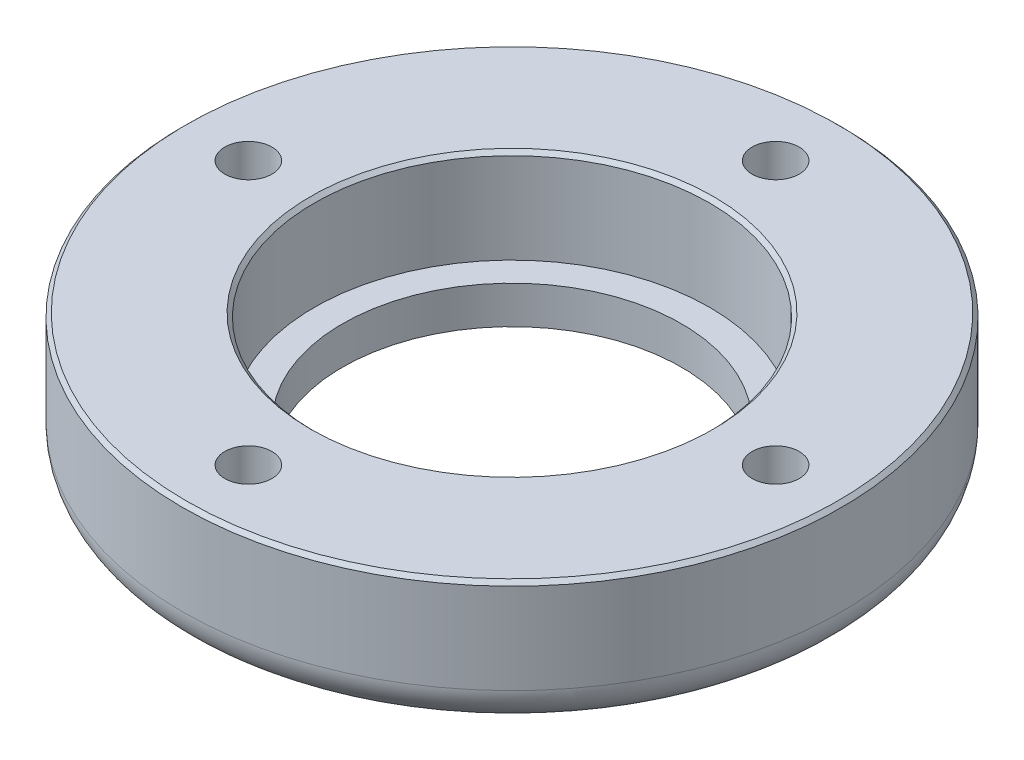
ISO-10303-21;
HEADER;
FILE_DESCRIPTION(('STEP AP214'),'2;1');
FILE_NAME('part.step','',(''),(''),'','','');
FILE_SCHEMA(('AUTOMOTIVE_DESIGN { 1 0 10303 214 1 1 1 1 }'));
ENDSEC;
DATA;
#1=APPLICATION_CONTEXT('core data for automotive mechanical design processes');
#2=APPLICATION_PROTOCOL_DEFINITION('international standard','automotive_design',2000,#1);
#3=PRODUCT_CONTEXT('',#1,'mechanical');
#4=PRODUCT('Part','Part','',(#3));
#5=PRODUCT_RELATED_PRODUCT_CATEGORY('part','',(#4));
#6=PRODUCT_DEFINITION_FORMATION('','',#4);
#7=PRODUCT_DEFINITION_CONTEXT('part definition',#1,'design');
#8=PRODUCT_DEFINITION('design','',#6,#7);
#9=PRODUCT_DEFINITION_SHAPE('','',#8);
#10=(LENGTH_UNIT() NAMED_UNIT(*) SI_UNIT(.MILLI.,.METRE.));
#11=(NAMED_UNIT(*) PLANE_ANGLE_UNIT() SI_UNIT($,.RADIAN.));
#12=(NAMED_UNIT(*) SI_UNIT($,.STERADIAN.) SOLID_ANGLE_UNIT());
#13=UNCERTAINTY_MEASURE_WITH_UNIT(LENGTH_MEASURE(1.E-05),#10,'distance_accuracy_value','');
#14=(GEOMETRIC_REPRESENTATION_CONTEXT(3) GLOBAL_UNCERTAINTY_ASSIGNED_CONTEXT((#13)) GLOBAL_UNIT_ASSIGNED_CONTEXT((#10,
#11,#12)) REPRESENTATION_CONTEXT('',''));
#15=CARTESIAN_POINT('',(0.,0.,0.));
#16=DIRECTION('',(0.,0.,1.));
#17=DIRECTION('',(1.,0.,0.));
#18=AXIS2_PLACEMENT_3D('',#15,#16,#17);
#19=CARTESIAN_POINT('',(0.,-2.,17.5));
#20=DIRECTION('',(0.,-1.,0.));
#21=DIRECTION('',(0.,0.,-1.));
#22=AXIS2_PLACEMENT_3D('',#19,#20,#21);
#23=PLANE('',#22);
#24=CARTESIAN_POINT('',(0.,-2.,0.));
#25=DIRECTION('',(0.,-1.,0.));
#26=DIRECTION('',(0.,0.,-1.));
#27=AXIS2_PLACEMENT_3D('',#24,#25,#26);
#28=CIRCLE('',#27,15.5);
#29=CARTESIAN_POINT('',(0.,-2.,-15.5));
#30=VERTEX_POINT('',#29);
#31=EDGE_CURVE('E10',#30,#30,#28,.T.);
#32=ORIENTED_EDGE('',*,*,#31,.T.);
#33=EDGE_LOOP('',(#32));
#34=FACE_BOUND('',#33,.T.);
#35=CARTESIAN_POINT('',(14.,-2.00000000000001,-1.46887230526424E-13));
#36=DIRECTION('',(0.,1.,0.));
#37=DIRECTION('',(0.,0.,1.));
#38=AXIS2_PLACEMENT_3D('',#35,#36,#37);
#39=CIRCLE('',#38,1.25);
#40=CARTESIAN_POINT('',(14.,-2.00000000000001,1.24999999999985));
#41=VERTEX_POINT('',#40);
#42=EDGE_CURVE('E86',#41,#41,#39,.T.);
#43=ORIENTED_EDGE('',*,*,#42,.T.);
#44=EDGE_LOOP('',(#43));
#45=FACE_BOUND('',#44,.T.);
#46=CARTESIAN_POINT('',(0.,-2.00000000000001,14.));
#47=DIRECTION('',(0.,1.,0.));
#48=DIRECTION('',(0.,0.,1.));
#49=AXIS2_PLACEMENT_3D('',#46,#47,#48);
#50=CIRCLE('',#49,1.25);
#51=CARTESIAN_POINT('',(0.,-2.00000000000001,15.25));
#52=VERTEX_POINT('',#51);
#53=EDGE_CURVE('E80',#52,#52,#50,.T.);
#54=ORIENTED_EDGE('',*,*,#53,.T.);
#55=EDGE_LOOP('',(#54));
#56=FACE_BOUND('',#55,.T.);
#57=CARTESIAN_POINT('',(-14.,-2.00000000000001,0.));
#58=DIRECTION('',(0.,1.,0.));
#59=DIRECTION('',(0.,0.,1.));
#60=AXIS2_PLACEMENT_3D('',#57,#58,#59);
#61=CIRCLE('',#60,1.25);
#62=CARTESIAN_POINT('',(-14.,-2.00000000000001,1.25000000000005));
#63=VERTEX_POINT('',#62);
#64=EDGE_CURVE('E74',#63,#63,#61,.T.);
#65=ORIENTED_EDGE('',*,*,#64,.T.);
#66=EDGE_LOOP('',(#65));
#67=FACE_BOUND('',#66,.T.);
#68=CARTESIAN_POINT('',(0.,-2.00000000000001,-14.));
#69=DIRECTION('',(0.,1.,0.));
#70=DIRECTION('',(0.,0.,1.));
#71=AXIS2_PLACEMENT_3D('',#68,#69,#70);
#72=CIRCLE('',#71,1.25);
#73=CARTESIAN_POINT('',(0.,-2.00000000000001,-12.75));
#74=VERTEX_POINT('',#73);
#75=EDGE_CURVE('E68',#74,#74,#72,.T.);
#76=ORIENTED_EDGE('',*,*,#75,.T.);
#77=EDGE_LOOP('',(#76));
#78=FACE_BOUND('',#77,.T.);
#79=CARTESIAN_POINT('',(0.,-2.,0.));
#80=DIRECTION('',(0.,1.,0.));
#81=DIRECTION('',(0.,0.,1.));
#82=AXIS2_PLACEMENT_3D('',#79,#80,#81);
#83=CIRCLE('',#82,9.);
#84=CARTESIAN_POINT('',(0.,-2.,9.));
#85=VERTEX_POINT('',#84);
#86=EDGE_CURVE('E59',#85,#85,#83,.T.);
#87=ORIENTED_EDGE('',*,*,#86,.T.);
#88=EDGE_LOOP('',(#87));
#89=FACE_BOUND('',#88,.T.);
#90=ADVANCED_FACE('F33',(#34,#45,#56,#67,#78,#89),#23,.T.);
#91=CARTESIAN_POINT('',(0.,0.,0.));
#92=DIRECTION('',(0.,1.,0.));
#93=DIRECTION('',(0.,0.,1.));
#94=AXIS2_PLACEMENT_3D('',#91,#92,#93);
#95=CYLINDRICAL_SURFACE('',#94,9.);
#96=CARTESIAN_POINT('',(0.,0.,0.));
#97=DIRECTION('',(0.,1.,0.));
#98=DIRECTION('',(0.,0.,1.));
#99=AXIS2_PLACEMENT_3D('',#96,#97,#98);
#100=CIRCLE('',#99,9.);
#101=CARTESIAN_POINT('',(0.,0.,9.));
#102=VERTEX_POINT('',#101);
#103=EDGE_CURVE('E62',#102,#102,#100,.T.);
#104=ORIENTED_EDGE('',*,*,#103,.T.);
#105=EDGE_LOOP('',(#104));
#106=FACE_BOUND('',#105,.T.);
#107=ORIENTED_EDGE('',*,*,#86,.F.);
#108=EDGE_LOOP('',(#107));
#109=FACE_BOUND('',#108,.T.);
#110=ADVANCED_FACE('F123',(#106,#109),#95,.F.);
#111=CARTESIAN_POINT('',(0.,0.,9.));
#112=DIRECTION('',(0.,1.,0.));
#113=DIRECTION('',(0.,0.,1.));
#114=AXIS2_PLACEMENT_3D('',#111,#112,#113);
#115=PLANE('',#114);
#116=CARTESIAN_POINT('',(0.,0.,0.));
#117=DIRECTION('',(0.,1.,0.));
#118=DIRECTION('',(0.,0.,1.));
#119=AXIS2_PLACEMENT_3D('',#116,#117,#118);
#120=CIRCLE('',#119,10.5);
#121=CARTESIAN_POINT('',(0.,0.,10.5));
#122=VERTEX_POINT('',#121);
#123=EDGE_CURVE('E65',#122,#122,#120,.T.);
#124=ORIENTED_EDGE('',*,*,#123,.T.);
#125=EDGE_LOOP('',(#124));
#126=FACE_BOUND('',#125,.T.);
#127=ORIENTED_EDGE('',*,*,#103,.F.);
#128=EDGE_LOOP('',(#127));
#129=FACE_BOUND('',#128,.T.);
#130=ADVANCED_FACE('F128',(#126,#129),#115,.T.);
#131=CARTESIAN_POINT('',(0.,0.,0.));
#132=DIRECTION('',(0.,1.,0.));
#133=DIRECTION('',(0.,0.,1.));
#134=AXIS2_PLACEMENT_3D('',#131,#132,#133);
#135=CYLINDRICAL_SURFACE('',#134,10.5);
#136=CARTESIAN_POINT('',(0.,4.80000000000003,0.));
#137=DIRECTION('',(0.,1.,0.));
#138=DIRECTION('',(0.,0.,1.));
#139=AXIS2_PLACEMENT_3D('',#136,#137,#138);
#140=CIRCLE('',#139,10.5);
#141=CARTESIAN_POINT('',(0.,4.80000000000003,10.5));
#142=VERTEX_POINT('',#141);
#143=EDGE_CURVE('E44',#142,#142,#140,.T.);
#144=ORIENTED_EDGE('',*,*,#143,.T.);
#145=EDGE_LOOP('',(#144));
#146=FACE_BOUND('',#145,.T.);
#147=ORIENTED_EDGE('',*,*,#123,.F.);
#148=EDGE_LOOP('',(#147));
#149=FACE_BOUND('',#148,.T.);
#150=ADVANCED_FACE('F99',(#146,#149),#135,.F.);
#151=CARTESIAN_POINT('',(0.,5.,10.5));
#152=DIRECTION('',(0.,1.,0.));
#153=DIRECTION('',(0.,0.,1.));
#154=AXIS2_PLACEMENT_3D('',#151,#152,#153);
#155=PLANE('',#154);
#156=CARTESIAN_POINT('',(0.,5.,0.));
#157=DIRECTION('',(0.,1.,0.));
#158=DIRECTION('',(0.,0.,1.));
#159=AXIS2_PLACEMENT_3D('',#156,#157,#158);
#160=CIRCLE('',#159,17.3);
#161=CARTESIAN_POINT('',(0.,5.,17.3));
#162=VERTEX_POINT('',#161);
#163=EDGE_CURVE('E53',#162,#162,#160,.T.);
#164=ORIENTED_EDGE('',*,*,#163,.T.);
#165=EDGE_LOOP('',(#164));
#166=FACE_BOUND('',#165,.T.);
#167=CARTESIAN_POINT('',(0.,5.,0.));
#168=DIRECTION('',(0.,1.,0.));
#169=DIRECTION('',(0.,0.,1.));
#170=AXIS2_PLACEMENT_3D('',#167,#168,#169);
#171=CIRCLE('',#170,10.7);
#172=CARTESIAN_POINT('',(0.,5.,10.7));
#173=VERTEX_POINT('',#172);
#174=EDGE_CURVE('E56',#173,#173,#171,.F.);
#175=ORIENTED_EDGE('',*,*,#174,.T.);
#176=EDGE_LOOP('',(#175));
#177=FACE_BOUND('',#176,.T.);
#178=CARTESIAN_POINT('',(14.,5.,-1.4602997776702E-13));
#179=DIRECTION('',(0.,1.,0.));
#180=DIRECTION('',(0.,0.,1.));
#181=AXIS2_PLACEMENT_3D('',#178,#179,#180);
#182=CIRCLE('',#181,1.25);
#183=CARTESIAN_POINT('',(14.,5.,1.24999999999985));
#184=VERTEX_POINT('',#183);
#185=EDGE_CURVE('E89',#184,#184,#182,.T.);
#186=ORIENTED_EDGE('',*,*,#185,.F.);
#187=EDGE_LOOP('',(#186));
#188=FACE_BOUND('',#187,.T.);
#189=CARTESIAN_POINT('',(0.,5.,14.));
#190=DIRECTION('',(0.,1.,0.));
#191=DIRECTION('',(0.,0.,1.));
#192=AXIS2_PLACEMENT_3D('',#189,#190,#191);
#193=CIRCLE('',#192,1.25);
#194=CARTESIAN_POINT('',(0.,5.,15.25));
#195=VERTEX_POINT('',#194);
#196=EDGE_CURVE('E83',#195,#195,#193,.T.);
#197=ORIENTED_EDGE('',*,*,#196,.F.);
#198=EDGE_LOOP('',(#197));
#199=FACE_BOUND('',#198,.T.);
#200=CARTESIAN_POINT('',(-14.,5.,0.));
#201=DIRECTION('',(0.,1.,0.));
#202=DIRECTION('',(0.,0.,1.));
#203=AXIS2_PLACEMENT_3D('',#200,#201,#202);
#204=CIRCLE('',#203,1.25);
#205=CARTESIAN_POINT('',(-14.,5.,1.25000000000005));
#206=VERTEX_POINT('',#205);
#207=EDGE_CURVE('E77',#206,#206,#204,.T.);
#208=ORIENTED_EDGE('',*,*,#207,.F.);
#209=EDGE_LOOP('',(#208));
#210=FACE_BOUND('',#209,.T.);
#211=CARTESIAN_POINT('',(0.,5.,-14.));
#212=DIRECTION('',(0.,1.,0.));
#213=DIRECTION('',(0.,0.,1.));
#214=AXIS2_PLACEMENT_3D('',#211,#212,#213);
#215=CIRCLE('',#214,1.25);
#216=CARTESIAN_POINT('',(0.,5.,-12.75));
#217=VERTEX_POINT('',#216);
#218=EDGE_CURVE('E71',#217,#217,#215,.T.);
#219=ORIENTED_EDGE('',*,*,#218,.F.);
#220=EDGE_LOOP('',(#219));
#221=FACE_BOUND('',#220,.T.);
#222=ADVANCED_FACE('F95',(#166,#177,#188,#199,#210,#221),#155,.T.);
#223=CARTESIAN_POINT('',(0.,0.,0.));
#224=DIRECTION('',(0.,1.,0.));
#225=DIRECTION('',(0.,0.,1.));
#226=AXIS2_PLACEMENT_3D('',#223,#224,#225);
#227=CYLINDRICAL_SURFACE('',#226,17.5);
#228=CARTESIAN_POINT('',(0.,0.,0.));
#229=DIRECTION('',(0.,-1.,0.));
#230=DIRECTION('',(0.,0.,-1.));
#231=AXIS2_PLACEMENT_3D('',#228,#229,#230);
#232=CIRCLE('',#231,17.5);
#233=CARTESIAN_POINT('',(0.,0.,-17.5));
#234=VERTEX_POINT('',#233);
#235=EDGE_CURVE('E40',#234,#234,#232,.F.);
#236=ORIENTED_EDGE('',*,*,#235,.T.);
#237=EDGE_LOOP('',(#236));
#238=FACE_BOUND('',#237,.T.);
#239=CARTESIAN_POINT('',(0.,4.8,0.));
#240=DIRECTION('',(0.,1.,0.));
#241=DIRECTION('',(0.,0.,1.));
#242=AXIS2_PLACEMENT_3D('',#239,#240,#241);
#243=CIRCLE('',#242,17.5);
#244=CARTESIAN_POINT('',(0.,4.8,17.5));
#245=VERTEX_POINT('',#244);
#246=EDGE_CURVE('E48',#245,#245,#243,.F.);
#247=ORIENTED_EDGE('',*,*,#246,.T.);
#248=EDGE_LOOP('',(#247));
#249=FACE_BOUND('',#248,.T.);
#250=ADVANCED_FACE('F98',(#238,#249),#227,.T.);
#251=CARTESIAN_POINT('',(0.,5.,-14.));
#252=DIRECTION('',(0.,1.,0.));
#253=DIRECTION('',(0.,0.,1.));
#254=AXIS2_PLACEMENT_3D('',#251,#252,#253);
#255=CYLINDRICAL_SURFACE('',#254,1.25);
#256=ORIENTED_EDGE('',*,*,#75,.F.);
#257=EDGE_LOOP('',(#256));
#258=FACE_BOUND('',#257,.T.);
#259=ORIENTED_EDGE('',*,*,#218,.T.);
#260=EDGE_LOOP('',(#259));
#261=FACE_BOUND('',#260,.T.);
#262=ADVANCED_FACE('F108',(#258,#261),#255,.F.);
#263=CARTESIAN_POINT('',(-14.,5.,0.));
#264=DIRECTION('',(0.,1.,0.));
#265=DIRECTION('',(0.,0.,1.));
#266=AXIS2_PLACEMENT_3D('',#263,#264,#265);
#267=CYLINDRICAL_SURFACE('',#266,1.25);
#268=ORIENTED_EDGE('',*,*,#64,.F.);
#269=EDGE_LOOP('',(#268));
#270=FACE_BOUND('',#269,.T.);
#271=ORIENTED_EDGE('',*,*,#207,.T.);
#272=EDGE_LOOP('',(#271));
#273=FACE_BOUND('',#272,.T.);
#274=ADVANCED_FACE('F110',(#270,#273),#267,.F.);
#275=CARTESIAN_POINT('',(0.,5.,14.));
#276=DIRECTION('',(0.,1.,0.));
#277=DIRECTION('',(0.,0.,1.));
#278=AXIS2_PLACEMENT_3D('',#275,#276,#277);
#279=CYLINDRICAL_SURFACE('',#278,1.25);
#280=ORIENTED_EDGE('',*,*,#53,.F.);
#281=EDGE_LOOP('',(#280));
#282=FACE_BOUND('',#281,.T.);
#283=ORIENTED_EDGE('',*,*,#196,.T.);
#284=EDGE_LOOP('',(#283));
#285=FACE_BOUND('',#284,.T.);
#286=ADVANCED_FACE('F117',(#282,#285),#279,.F.);
#287=CARTESIAN_POINT('',(14.,5.,-1.4602997776702E-13));
#288=DIRECTION('',(0.,1.,0.));
#289=DIRECTION('',(0.,0.,1.));
#290=AXIS2_PLACEMENT_3D('',#287,#288,#289);
#291=CYLINDRICAL_SURFACE('',#290,1.25);
#292=ORIENTED_EDGE('',*,*,#42,.F.);
#293=EDGE_LOOP('',(#292));
#294=FACE_BOUND('',#293,.T.);
#295=ORIENTED_EDGE('',*,*,#185,.T.);
#296=EDGE_LOOP('',(#295));
#297=FACE_BOUND('',#296,.T.);
#298=ADVANCED_FACE('F93',(#294,#297),#291,.F.);
#299=CARTESIAN_POINT('',(0.,5.,0.));
#300=DIRECTION('',(0.,-1.,0.));
#301=DIRECTION('',(0.,0.,-1.));
#302=AXIS2_PLACEMENT_3D('',#299,#300,#301);
#303=CONICAL_SURFACE('',#302,17.3,0.785398163397457);
#304=ORIENTED_EDGE('',*,*,#246,.F.);
#305=EDGE_LOOP('',(#304));
#306=FACE_BOUND('',#305,.T.);
#307=ORIENTED_EDGE('',*,*,#163,.F.);
#308=EDGE_LOOP('',(#307));
#309=FACE_BOUND('',#308,.T.);
#310=ADVANCED_FACE('F134',(#306,#309),#303,.T.);
#311=CARTESIAN_POINT('',(0.,4.80000000000003,0.));
#312=DIRECTION('',(0.,1.,0.));
#313=DIRECTION('',(0.,0.,1.));
#314=AXIS2_PLACEMENT_3D('',#311,#312,#313);
#315=CONICAL_SURFACE('',#314,10.5,0.78539816339747);
#316=ORIENTED_EDGE('',*,*,#174,.F.);
#317=EDGE_LOOP('',(#316));
#318=FACE_BOUND('',#317,.T.);
#319=ORIENTED_EDGE('',*,*,#143,.F.);
#320=EDGE_LOOP('',(#319));
#321=FACE_BOUND('',#320,.T.);
#322=ADVANCED_FACE('F136',(#318,#321),#315,.F.);
#323=CARTESIAN_POINT('',(0.,0.,0.));
#324=DIRECTION('',(0.,-1.,0.));
#325=DIRECTION('',(0.,0.,-1.));
#326=AXIS2_PLACEMENT_3D('',#323,#324,#325);
#327=TOROIDAL_SURFACE('',#326,15.5,2.);
#328=ORIENTED_EDGE('',*,*,#31,.F.);
#329=EDGE_LOOP('',(#328));
#330=FACE_BOUND('',#329,.T.);
#331=ORIENTED_EDGE('',*,*,#235,.F.);
#332=EDGE_LOOP('',(#331));
#333=FACE_BOUND('',#332,.T.);
#334=ADVANCED_FACE('F35',(#330,#333),#327,.T.);
#335=CLOSED_SHELL('',(#90,#110,#130,#150,#222,#250,#262,#274,#286,#298,#310,#322,#334));
#336=MANIFOLD_SOLID_BREP('B2',#335);
#337=ADVANCED_BREP_SHAPE_REPRESENTATION('',(#18,#336),#14);
#338=SHAPE_DEFINITION_REPRESENTATION(#9,#337);
ENDSEC;
END-ISO-10303-21;
